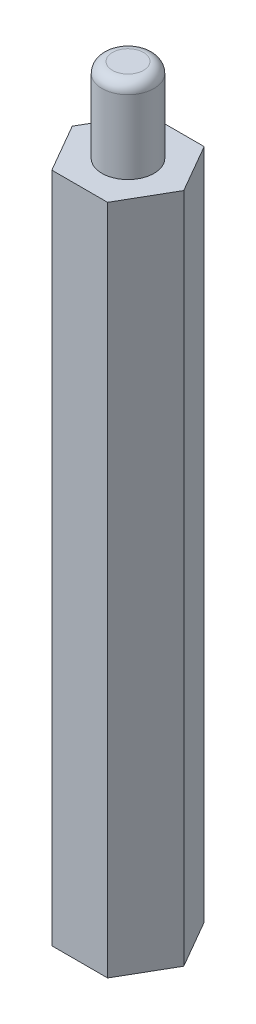
ISO-10303-21;
HEADER;
FILE_DESCRIPTION(('STEP AP214'),'2;1');
FILE_NAME('part.step','',(''),(''),'','','');
FILE_SCHEMA(('AUTOMOTIVE_DESIGN { 1 0 10303 214 1 1 1 1 }'));
ENDSEC;
DATA;
#1=APPLICATION_CONTEXT('core data for automotive mechanical design processes');
#2=APPLICATION_PROTOCOL_DEFINITION('international standard','automotive_design',2000,#1);
#3=PRODUCT_CONTEXT('',#1,'mechanical');
#4=PRODUCT('Part','Part','',(#3));
#5=PRODUCT_RELATED_PRODUCT_CATEGORY('part','',(#4));
#6=PRODUCT_DEFINITION_FORMATION('','',#4);
#7=PRODUCT_DEFINITION_CONTEXT('part definition',#1,'design');
#8=PRODUCT_DEFINITION('design','',#6,#7);
#9=PRODUCT_DEFINITION_SHAPE('','',#8);
#10=(LENGTH_UNIT() NAMED_UNIT(*) SI_UNIT(.MILLI.,.METRE.));
#11=(NAMED_UNIT(*) PLANE_ANGLE_UNIT() SI_UNIT($,.RADIAN.));
#12=(NAMED_UNIT(*) SI_UNIT($,.STERADIAN.) SOLID_ANGLE_UNIT());
#13=UNCERTAINTY_MEASURE_WITH_UNIT(LENGTH_MEASURE(1.E-05),#10,'distance_accuracy_value','');
#14=(GEOMETRIC_REPRESENTATION_CONTEXT(3) GLOBAL_UNCERTAINTY_ASSIGNED_CONTEXT((#13)) GLOBAL_UNIT_ASSIGNED_CONTEXT((#10,
#11,#12)) REPRESENTATION_CONTEXT('',''));
#15=CARTESIAN_POINT('',(0.,0.,0.));
#16=DIRECTION('',(0.,0.,1.));
#17=DIRECTION('',(1.,0.,0.));
#18=AXIS2_PLACEMENT_3D('',#15,#16,#17);
#19=CARTESIAN_POINT('',(1.32790561913614,32.,2.30000000000001));
#20=DIRECTION('',(-0.866025403784438,0.,-0.500000000000001));
#21=DIRECTION('',(-0.500000000000001,0.,0.866025403784438));
#22=AXIS2_PLACEMENT_3D('',#19,#20,#21);
#23=PLANE('',#22);
#24=DIRECTION('',(0.500000000000001,0.,-0.866025403784438));
#25=VECTOR('',#24,1.);
#26=CARTESIAN_POINT('',(1.32790561913614,0.,2.30000000000001));
#27=LINE('',#26,#25);
#28=CARTESIAN_POINT('',(1.32790561913614,0.,2.30000000000001));
#29=VERTEX_POINT('',#28);
#30=CARTESIAN_POINT('',(2.65581123827228,0.,0.));
#31=VERTEX_POINT('',#30);
#32=EDGE_CURVE('E118',#29,#31,#27,.T.);
#33=ORIENTED_EDGE('',*,*,#32,.T.);
#34=DIRECTION('',(0.,-1.,0.));
#35=VECTOR('',#34,1.);
#36=CARTESIAN_POINT('',(2.65581123827228,32.,0.));
#37=LINE('',#36,#35);
#38=CARTESIAN_POINT('',(2.65581123827228,32.,0.));
#39=VERTEX_POINT('',#38);
#40=EDGE_CURVE('E136',#39,#31,#37,.T.);
#41=ORIENTED_EDGE('',*,*,#40,.F.);
#42=DIRECTION('',(0.500000000000001,0.,-0.866025403784438));
#43=VECTOR('',#42,1.);
#44=CARTESIAN_POINT('',(1.32790561913614,32.,2.30000000000001));
#45=LINE('',#44,#43);
#46=CARTESIAN_POINT('',(1.32790561913614,32.,2.30000000000001));
#47=VERTEX_POINT('',#46);
#48=EDGE_CURVE('E129',#47,#39,#45,.T.);
#49=ORIENTED_EDGE('',*,*,#48,.F.);
#50=DIRECTION('',(0.,-1.,0.));
#51=VECTOR('',#50,1.);
#52=CARTESIAN_POINT('',(1.32790561913614,32.,2.30000000000001));
#53=LINE('',#52,#51);
#54=EDGE_CURVE('E114',#47,#29,#53,.T.);
#55=ORIENTED_EDGE('',*,*,#54,.T.);
#56=EDGE_LOOP('',(#33,#41,#49,#55));
#57=FACE_BOUND('',#56,.T.);
#58=ADVANCED_FACE('F32',(#57),#23,.F.);
#59=CARTESIAN_POINT('',(2.65581123827228,32.,0.));
#60=DIRECTION('',(-0.866025403784438,0.,0.5));
#61=DIRECTION('',(0.5,0.,0.866025403784439));
#62=AXIS2_PLACEMENT_3D('',#59,#60,#61);
#63=PLANE('',#62);
#64=DIRECTION('',(-0.5,0.,-0.866025403784438));
#65=VECTOR('',#64,1.);
#66=CARTESIAN_POINT('',(2.65581123827228,0.,0.));
#67=LINE('',#66,#65);
#68=CARTESIAN_POINT('',(1.32790561913614,0.,-2.30000000000001));
#69=VERTEX_POINT('',#68);
#70=EDGE_CURVE('E121',#31,#69,#67,.T.);
#71=ORIENTED_EDGE('',*,*,#70,.T.);
#72=DIRECTION('',(0.,-1.,0.));
#73=VECTOR('',#72,1.);
#74=CARTESIAN_POINT('',(1.32790561913614,32.,-2.30000000000001));
#75=LINE('',#74,#73);
#76=CARTESIAN_POINT('',(1.32790561913614,32.,-2.30000000000001));
#77=VERTEX_POINT('',#76);
#78=EDGE_CURVE('E133',#77,#69,#75,.T.);
#79=ORIENTED_EDGE('',*,*,#78,.F.);
#80=DIRECTION('',(-0.5,0.,-0.866025403784438));
#81=VECTOR('',#80,1.);
#82=CARTESIAN_POINT('',(2.65581123827228,32.,0.));
#83=LINE('',#82,#81);
#84=EDGE_CURVE('E87',#39,#77,#83,.T.);
#85=ORIENTED_EDGE('',*,*,#84,.F.);
#86=ORIENTED_EDGE('',*,*,#40,.T.);
#87=EDGE_LOOP('',(#71,#79,#85,#86));
#88=FACE_BOUND('',#87,.T.);
#89=ADVANCED_FACE('F152',(#88),#63,.F.);
#90=CARTESIAN_POINT('',(1.32790561913614,32.,-2.30000000000001));
#91=DIRECTION('',(0.,0.,1.));
#92=DIRECTION('',(1.,0.,0.));
#93=AXIS2_PLACEMENT_3D('',#90,#91,#92);
#94=PLANE('',#93);
#95=DIRECTION('',(-1.,0.,0.));
#96=VECTOR('',#95,1.);
#97=CARTESIAN_POINT('',(1.32790561913614,0.,-2.30000000000001));
#98=LINE('',#97,#96);
#99=CARTESIAN_POINT('',(-1.32790561913614,0.,-2.30000000000001));
#100=VERTEX_POINT('',#99);
#101=EDGE_CURVE('E124',#69,#100,#98,.T.);
#102=ORIENTED_EDGE('',*,*,#101,.T.);
#103=DIRECTION('',(0.,-1.,0.));
#104=VECTOR('',#103,1.);
#105=CARTESIAN_POINT('',(-1.32790561913614,32.,-2.30000000000001));
#106=LINE('',#105,#104);
#107=CARTESIAN_POINT('',(-1.32790561913614,32.,-2.30000000000001));
#108=VERTEX_POINT('',#107);
#109=EDGE_CURVE('E109',#108,#100,#106,.T.);
#110=ORIENTED_EDGE('',*,*,#109,.F.);
#111=DIRECTION('',(-1.,0.,0.));
#112=VECTOR('',#111,1.);
#113=CARTESIAN_POINT('',(1.32790561913614,32.,-2.30000000000001));
#114=LINE('',#113,#112);
#115=EDGE_CURVE('E100',#77,#108,#114,.T.);
#116=ORIENTED_EDGE('',*,*,#115,.F.);
#117=ORIENTED_EDGE('',*,*,#78,.T.);
#118=EDGE_LOOP('',(#102,#110,#116,#117));
#119=FACE_BOUND('',#118,.T.);
#120=ADVANCED_FACE('F155',(#119),#94,.F.);
#121=CARTESIAN_POINT('',(-1.32790561913614,32.,-2.30000000000001));
#122=DIRECTION('',(0.866025403784438,0.,0.5));
#123=DIRECTION('',(0.5,0.,-0.866025403784439));
#124=AXIS2_PLACEMENT_3D('',#121,#122,#123);
#125=PLANE('',#124);
#126=DIRECTION('',(-0.5,0.,0.866025403784438));
#127=VECTOR('',#126,1.);
#128=CARTESIAN_POINT('',(-1.32790561913614,0.,-2.30000000000001));
#129=LINE('',#128,#127);
#130=CARTESIAN_POINT('',(-2.65581123827229,0.,0.));
#131=VERTEX_POINT('',#130);
#132=EDGE_CURVE('E108',#100,#131,#129,.T.);
#133=ORIENTED_EDGE('',*,*,#132,.T.);
#134=DIRECTION('',(0.,-1.,0.));
#135=VECTOR('',#134,1.);
#136=CARTESIAN_POINT('',(-2.65581123827229,32.,0.));
#137=LINE('',#136,#135);
#138=CARTESIAN_POINT('',(-2.65581123827229,32.,0.));
#139=VERTEX_POINT('',#138);
#140=EDGE_CURVE('E105',#139,#131,#137,.T.);
#141=ORIENTED_EDGE('',*,*,#140,.F.);
#142=DIRECTION('',(-0.5,0.,0.866025403784438));
#143=VECTOR('',#142,1.);
#144=CARTESIAN_POINT('',(-1.32790561913614,32.,-2.30000000000001));
#145=LINE('',#144,#143);
#146=EDGE_CURVE('E94',#108,#139,#145,.T.);
#147=ORIENTED_EDGE('',*,*,#146,.F.);
#148=ORIENTED_EDGE('',*,*,#109,.T.);
#149=EDGE_LOOP('',(#133,#141,#147,#148));
#150=FACE_BOUND('',#149,.T.);
#151=ADVANCED_FACE('F106',(#150),#125,.F.);
#152=CARTESIAN_POINT('',(-2.65581123827229,32.,0.));
#153=DIRECTION('',(0.866025403784438,0.,-0.5));
#154=DIRECTION('',(-0.5,0.,-0.866025403784439));
#155=AXIS2_PLACEMENT_3D('',#152,#153,#154);
#156=PLANE('',#155);
#157=DIRECTION('',(0.5,0.,0.866025403784438));
#158=VECTOR('',#157,1.);
#159=CARTESIAN_POINT('',(-2.65581123827229,0.,0.));
#160=LINE('',#159,#158);
#161=CARTESIAN_POINT('',(-1.32790561913614,0.,2.30000000000001));
#162=VERTEX_POINT('',#161);
#163=EDGE_CURVE('E72',#131,#162,#160,.T.);
#164=ORIENTED_EDGE('',*,*,#163,.T.);
#165=DIRECTION('',(0.,-1.,0.));
#166=VECTOR('',#165,1.);
#167=CARTESIAN_POINT('',(-1.32790561913614,32.,2.30000000000001));
#168=LINE('',#167,#166);
#169=CARTESIAN_POINT('',(-1.32790561913614,32.,2.30000000000001));
#170=VERTEX_POINT('',#169);
#171=EDGE_CURVE('E110',#170,#162,#168,.T.);
#172=ORIENTED_EDGE('',*,*,#171,.F.);
#173=DIRECTION('',(0.5,0.,0.866025403784438));
#174=VECTOR('',#173,1.);
#175=CARTESIAN_POINT('',(-2.65581123827229,32.,0.));
#176=LINE('',#175,#174);
#177=EDGE_CURVE('E98',#139,#170,#176,.T.);
#178=ORIENTED_EDGE('',*,*,#177,.F.);
#179=ORIENTED_EDGE('',*,*,#140,.T.);
#180=EDGE_LOOP('',(#164,#172,#178,#179));
#181=FACE_BOUND('',#180,.T.);
#182=ADVANCED_FACE('F112',(#181),#156,.F.);
#183=CARTESIAN_POINT('',(-1.32790561913614,32.,2.30000000000001));
#184=DIRECTION('',(0.,0.,-1.));
#185=DIRECTION('',(-1.,0.,0.));
#186=AXIS2_PLACEMENT_3D('',#183,#184,#185);
#187=PLANE('',#186);
#188=DIRECTION('',(1.,0.,0.));
#189=VECTOR('',#188,1.);
#190=CARTESIAN_POINT('',(-1.32790561913614,0.,2.30000000000001));
#191=LINE('',#190,#189);
#192=EDGE_CURVE('E78',#162,#29,#191,.T.);
#193=ORIENTED_EDGE('',*,*,#192,.T.);
#194=ORIENTED_EDGE('',*,*,#54,.F.);
#195=DIRECTION('',(1.,0.,0.));
#196=VECTOR('',#195,1.);
#197=CARTESIAN_POINT('',(-1.32790561913614,32.,2.30000000000001));
#198=LINE('',#197,#196);
#199=EDGE_CURVE('E49',#170,#47,#198,.T.);
#200=ORIENTED_EDGE('',*,*,#199,.F.);
#201=ORIENTED_EDGE('',*,*,#171,.T.);
#202=EDGE_LOOP('',(#193,#194,#200,#201));
#203=FACE_BOUND('',#202,.T.);
#204=ADVANCED_FACE('F160',(#203),#187,.F.);
#205=CARTESIAN_POINT('',(0.,32.,0.));
#206=DIRECTION('',(0.,1.,0.));
#207=DIRECTION('',(0.,0.,1.));
#208=AXIS2_PLACEMENT_3D('',#205,#206,#207);
#209=PLANE('',#208);
#210=CARTESIAN_POINT('',(0.,32.,0.));
#211=DIRECTION('',(0.,1.,0.));
#212=DIRECTION('',(0.,0.,1.));
#213=AXIS2_PLACEMENT_3D('',#210,#211,#212);
#214=CIRCLE('',#213,1.24);
#215=CARTESIAN_POINT('',(0.,32.,1.24));
#216=VERTEX_POINT('',#215);
#217=EDGE_CURVE('E137',#216,#216,#214,.T.);
#218=ORIENTED_EDGE('',*,*,#217,.F.);
#219=EDGE_LOOP('',(#218));
#220=FACE_BOUND('',#219,.T.);
#221=ORIENTED_EDGE('',*,*,#48,.T.);
#222=ORIENTED_EDGE('',*,*,#84,.T.);
#223=ORIENTED_EDGE('',*,*,#115,.T.);
#224=ORIENTED_EDGE('',*,*,#146,.T.);
#225=ORIENTED_EDGE('',*,*,#177,.T.);
#226=ORIENTED_EDGE('',*,*,#199,.T.);
#227=EDGE_LOOP('',(#221,#222,#223,#224,#225,#226));
#228=FACE_BOUND('',#227,.T.);
#229=ADVANCED_FACE('F96',(#220,#228),#209,.T.);
#230=CARTESIAN_POINT('',(0.,0.,0.));
#231=DIRECTION('',(0.,1.,0.));
#232=DIRECTION('',(0.,0.,1.));
#233=AXIS2_PLACEMENT_3D('',#230,#231,#232);
#234=PLANE('',#233);
#235=CARTESIAN_POINT('',(0.,0.,0.));
#236=DIRECTION('',(0.,-1.,0.));
#237=DIRECTION('',(0.,0.,-1.));
#238=AXIS2_PLACEMENT_3D('',#235,#236,#237);
#239=CIRCLE('',#238,1.25);
#240=CARTESIAN_POINT('',(0.,0.,-1.25));
#241=VERTEX_POINT('',#240);
#242=EDGE_CURVE('E147',#241,#241,#239,.T.);
#243=ORIENTED_EDGE('',*,*,#242,.F.);
#244=EDGE_LOOP('',(#243));
#245=FACE_BOUND('',#244,.T.);
#246=ORIENTED_EDGE('',*,*,#32,.F.);
#247=ORIENTED_EDGE('',*,*,#192,.F.);
#248=ORIENTED_EDGE('',*,*,#163,.F.);
#249=ORIENTED_EDGE('',*,*,#132,.F.);
#250=ORIENTED_EDGE('',*,*,#101,.F.);
#251=ORIENTED_EDGE('',*,*,#70,.F.);
#252=EDGE_LOOP('',(#246,#247,#248,#249,#250,#251));
#253=FACE_BOUND('',#252,.T.);
#254=ADVANCED_FACE('F158',(#245,#253),#234,.F.);
#255=CARTESIAN_POINT('',(0.,36.,0.));
#256=DIRECTION('',(0.,-1.,0.));
#257=DIRECTION('',(0.,0.,-1.));
#258=AXIS2_PLACEMENT_3D('',#255,#256,#257);
#259=CYLINDRICAL_SURFACE('',#258,1.24);
#260=CARTESIAN_POINT('',(0.,35.5,0.));
#261=DIRECTION('',(0.,1.,0.));
#262=DIRECTION('',(0.,0.,1.));
#263=AXIS2_PLACEMENT_3D('',#260,#261,#262);
#264=CIRCLE('',#263,1.24);
#265=CARTESIAN_POINT('',(0.,35.5,1.24));
#266=VERTEX_POINT('',#265);
#267=EDGE_CURVE('E11',#266,#266,#264,.F.);
#268=ORIENTED_EDGE('',*,*,#267,.T.);
#269=EDGE_LOOP('',(#268));
#270=FACE_BOUND('',#269,.T.);
#271=ORIENTED_EDGE('',*,*,#217,.T.);
#272=EDGE_LOOP('',(#271));
#273=FACE_BOUND('',#272,.T.);
#274=ADVANCED_FACE('F205',(#270,#273),#259,.T.);
#275=CARTESIAN_POINT('',(0.,36.,0.));
#276=DIRECTION('',(0.,1.,0.));
#277=DIRECTION('',(0.,0.,1.));
#278=AXIS2_PLACEMENT_3D('',#275,#276,#277);
#279=PLANE('',#278);
#280=CARTESIAN_POINT('',(0.,36.,0.));
#281=DIRECTION('',(0.,1.,0.));
#282=DIRECTION('',(0.,0.,1.));
#283=AXIS2_PLACEMENT_3D('',#280,#281,#282);
#284=CIRCLE('',#283,0.74);
#285=CARTESIAN_POINT('',(0.,36.,0.74));
#286=VERTEX_POINT('',#285);
#287=EDGE_CURVE('E41',#286,#286,#284,.T.);
#288=ORIENTED_EDGE('',*,*,#287,.T.);
#289=EDGE_LOOP('',(#288));
#290=FACE_BOUND('',#289,.T.);
#291=ADVANCED_FACE('F210',(#290),#279,.T.);
#292=CARTESIAN_POINT('',(0.,35.5,0.));
#293=DIRECTION('',(0.,1.,0.));
#294=DIRECTION('',(0.,0.,1.));
#295=AXIS2_PLACEMENT_3D('',#292,#293,#294);
#296=TOROIDAL_SURFACE('',#295,0.74,0.5);
#297=ORIENTED_EDGE('',*,*,#267,.F.);
#298=EDGE_LOOP('',(#297));
#299=FACE_BOUND('',#298,.T.);
#300=ORIENTED_EDGE('',*,*,#287,.F.);
#301=EDGE_LOOP('',(#300));
#302=FACE_BOUND('',#301,.T.);
#303=ADVANCED_FACE('F34',(#299,#302),#296,.T.);
#304=CARTESIAN_POINT('',(0.,4.,0.));
#305=DIRECTION('',(0.,-1.,0.));
#306=DIRECTION('',(0.,0.,-1.));
#307=AXIS2_PLACEMENT_3D('',#304,#305,#306);
#308=CYLINDRICAL_SURFACE('',#307,1.25);
#309=CARTESIAN_POINT('',(0.,4.,0.));
#310=DIRECTION('',(0.,-1.,0.));
#311=DIRECTION('',(0.,0.,-1.));
#312=AXIS2_PLACEMENT_3D('',#309,#310,#311);
#313=CIRCLE('',#312,1.25);
#314=CARTESIAN_POINT('',(0.,4.,-1.25));
#315=VERTEX_POINT('',#314);
#316=EDGE_CURVE('E122',#315,#315,#313,.T.);
#317=ORIENTED_EDGE('',*,*,#316,.F.);
#318=EDGE_LOOP('',(#317));
#319=FACE_BOUND('',#318,.T.);
#320=ORIENTED_EDGE('',*,*,#242,.T.);
#321=EDGE_LOOP('',(#320));
#322=FACE_BOUND('',#321,.T.);
#323=ADVANCED_FACE('F228',(#319,#322),#308,.F.);
#324=CARTESIAN_POINT('',(0.,4.,0.));
#325=DIRECTION('',(0.,-1.,0.));
#326=DIRECTION('',(0.,0.,-1.));
#327=AXIS2_PLACEMENT_3D('',#324,#325,#326);
#328=PLANE('',#327);
#329=ORIENTED_EDGE('',*,*,#316,.T.);
#330=EDGE_LOOP('',(#329));
#331=FACE_BOUND('',#330,.T.);
#332=ADVANCED_FACE('F243',(#331),#328,.T.);
#333=CLOSED_SHELL('',(#58,#89,#120,#151,#182,#204,#229,#254,#274,#291,#303,#323,#332));
#334=MANIFOLD_SOLID_BREP('B2',#333);
#335=ADVANCED_BREP_SHAPE_REPRESENTATION('',(#18,#334),#14);
#336=SHAPE_DEFINITION_REPRESENTATION(#9,#335);
ENDSEC;
END-ISO-10303-21;
